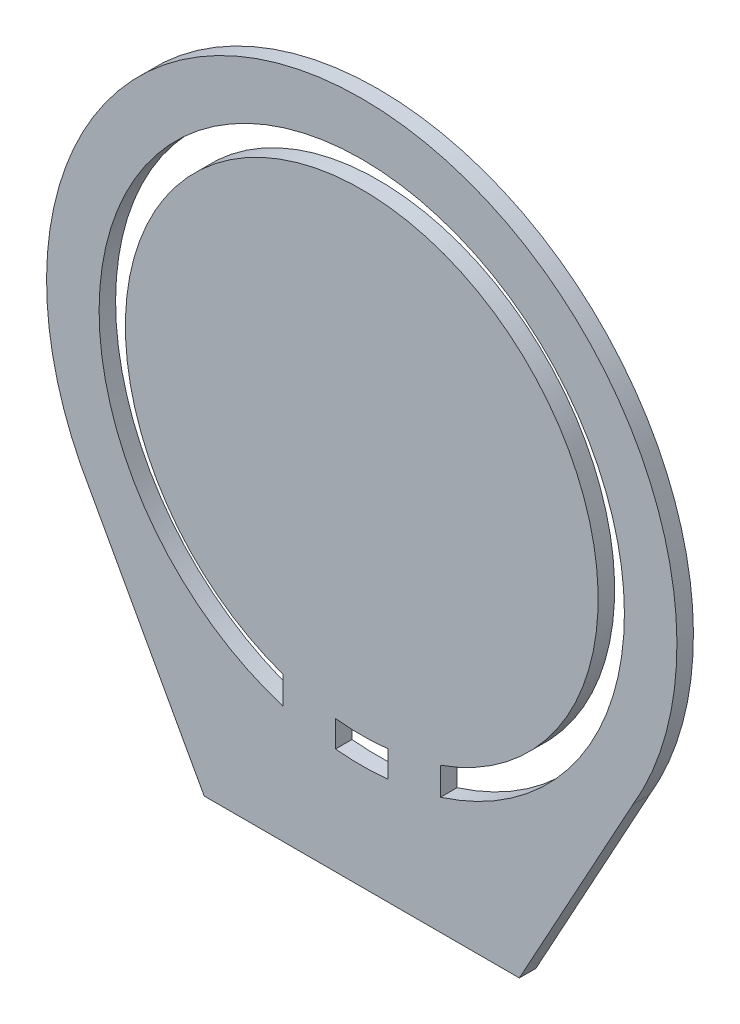
ISO-10303-21;
HEADER;
FILE_DESCRIPTION(('STEP AP214'),'2;1');
FILE_NAME('part.step','',(''),(''),'','','');
FILE_SCHEMA(('AUTOMOTIVE_DESIGN { 1 0 10303 214 1 1 1 1 }'));
ENDSEC;
DATA;
#1=APPLICATION_CONTEXT('core data for automotive mechanical design processes');
#2=APPLICATION_PROTOCOL_DEFINITION('international standard','automotive_design',2000,#1);
#3=PRODUCT_CONTEXT('',#1,'mechanical');
#4=PRODUCT('Part','Part','',(#3));
#5=PRODUCT_RELATED_PRODUCT_CATEGORY('part','',(#4));
#6=PRODUCT_DEFINITION_FORMATION('','',#4);
#7=PRODUCT_DEFINITION_CONTEXT('part definition',#1,'design');
#8=PRODUCT_DEFINITION('design','',#6,#7);
#9=PRODUCT_DEFINITION_SHAPE('','',#8);
#10=(LENGTH_UNIT() NAMED_UNIT(*) SI_UNIT(.MILLI.,.METRE.));
#11=(NAMED_UNIT(*) PLANE_ANGLE_UNIT() SI_UNIT($,.RADIAN.));
#12=(NAMED_UNIT(*) SI_UNIT($,.STERADIAN.) SOLID_ANGLE_UNIT());
#13=UNCERTAINTY_MEASURE_WITH_UNIT(LENGTH_MEASURE(1.E-05),#10,'distance_accuracy_value','');
#14=(GEOMETRIC_REPRESENTATION_CONTEXT(3) GLOBAL_UNCERTAINTY_ASSIGNED_CONTEXT((#13)) GLOBAL_UNIT_ASSIGNED_CONTEXT((#10,
#11,#12)) REPRESENTATION_CONTEXT('',''));
#15=CARTESIAN_POINT('',(0.,0.,0.));
#16=DIRECTION('',(0.,0.,1.));
#17=DIRECTION('',(1.,0.,0.));
#18=AXIS2_PLACEMENT_3D('',#15,#16,#17);
#19=CARTESIAN_POINT('',(0.,0.,1.57));
#20=DIRECTION('',(0.,0.,-1.));
#21=DIRECTION('',(-1.,0.,0.));
#22=AXIS2_PLACEMENT_3D('',#19,#20,#21);
#23=CYLINDRICAL_SURFACE('',#22,25.);
#24=CARTESIAN_POINT('',(0.,0.,0.));
#25=DIRECTION('',(0.,0.,1.));
#26=DIRECTION('',(1.,0.,0.));
#27=AXIS2_PLACEMENT_3D('',#24,#25,#26);
#28=CIRCLE('',#27,25.);
#29=CARTESIAN_POINT('',(7.5,-23.8484800354236,0.));
#30=VERTEX_POINT('',#29);
#31=CARTESIAN_POINT('',(-7.5,-23.8484800354236,0.));
#32=VERTEX_POINT('',#31);
#33=EDGE_CURVE('E191',#30,#32,#28,.T.);
#34=ORIENTED_EDGE('',*,*,#33,.F.);
#35=DIRECTION('',(0.,0.,-1.));
#36=VECTOR('',#35,1.);
#37=CARTESIAN_POINT('',(7.5,-23.8484800354236,1.57));
#38=LINE('',#37,#36);
#39=CARTESIAN_POINT('',(7.5,-23.8484800354236,1.57));
#40=VERTEX_POINT('',#39);
#41=EDGE_CURVE('E47',#30,#40,#38,.F.);
#42=ORIENTED_EDGE('',*,*,#41,.T.);
#43=CARTESIAN_POINT('',(0.,0.,1.57));
#44=DIRECTION('',(0.,0.,1.));
#45=DIRECTION('',(1.,0.,0.));
#46=AXIS2_PLACEMENT_3D('',#43,#44,#45);
#47=CIRCLE('',#46,25.);
#48=CARTESIAN_POINT('',(-7.5,-23.8484800354236,1.57));
#49=VERTEX_POINT('',#48);
#50=EDGE_CURVE('E202',#40,#49,#47,.T.);
#51=ORIENTED_EDGE('',*,*,#50,.T.);
#52=DIRECTION('',(0.,0.,-1.));
#53=VECTOR('',#52,1.);
#54=CARTESIAN_POINT('',(-7.5,-23.8484800354236,1.57));
#55=LINE('',#54,#53);
#56=EDGE_CURVE('E211',#32,#49,#55,.F.);
#57=ORIENTED_EDGE('',*,*,#56,.F.);
#58=EDGE_LOOP('',(#34,#42,#51,#57));
#59=FACE_BOUND('',#58,.T.);
#60=ADVANCED_FACE('F39',(#59),#23,.F.);
#61=CARTESIAN_POINT('',(0.,0.,1.57));
#62=DIRECTION('',(0.,0.,-1.));
#63=DIRECTION('',(-1.,0.,0.));
#64=AXIS2_PLACEMENT_3D('',#61,#62,#63);
#65=CYLINDRICAL_SURFACE('',#64,30.);
#66=DIRECTION('',(0.,0.,1.));
#67=VECTOR('',#66,1.);
#68=CARTESIAN_POINT('',(-25.8005366625302,-15.3079165115778,0.));
#69=LINE('',#68,#67);
#70=CARTESIAN_POINT('',(-25.8005366625302,-15.3079165115778,0.));
#71=VERTEX_POINT('',#70);
#72=CARTESIAN_POINT('',(-25.8005366625302,-15.3079165115778,1.57));
#73=VERTEX_POINT('',#72);
#74=EDGE_CURVE('E188',#71,#73,#69,.T.);
#75=ORIENTED_EDGE('',*,*,#74,.T.);
#76=CARTESIAN_POINT('',(0.,0.,1.57));
#77=DIRECTION('',(0.,0.,1.));
#78=DIRECTION('',(1.,0.,0.));
#79=AXIS2_PLACEMENT_3D('',#76,#77,#78);
#80=CIRCLE('',#79,30.);
#81=CARTESIAN_POINT('',(25.8005366625301,-15.3079165115779,1.57));
#82=VERTEX_POINT('',#81);
#83=EDGE_CURVE('E205',#82,#73,#80,.T.);
#84=ORIENTED_EDGE('',*,*,#83,.F.);
#85=DIRECTION('',(0.,0.,1.));
#86=VECTOR('',#85,1.);
#87=CARTESIAN_POINT('',(25.8005366625301,-15.3079165115779,0.));
#88=LINE('',#87,#86);
#89=CARTESIAN_POINT('',(25.8005366625301,-15.3079165115779,0.));
#90=VERTEX_POINT('',#89);
#91=EDGE_CURVE('E192',#90,#82,#88,.T.);
#92=ORIENTED_EDGE('',*,*,#91,.F.);
#93=CARTESIAN_POINT('',(0.,0.,0.));
#94=DIRECTION('',(0.,0.,1.));
#95=DIRECTION('',(1.,0.,0.));
#96=AXIS2_PLACEMENT_3D('',#93,#94,#95);
#97=CIRCLE('',#96,30.);
#98=EDGE_CURVE('E201',#90,#71,#97,.T.);
#99=ORIENTED_EDGE('',*,*,#98,.T.);
#100=EDGE_LOOP('',(#75,#84,#92,#99));
#101=FACE_BOUND('',#100,.T.);
#102=ADVANCED_FACE('F41',(#101),#65,.T.);
#103=CARTESIAN_POINT('',(0.,0.,1.57));
#104=DIRECTION('',(0.,0.,1.));
#105=DIRECTION('',(1.,0.,0.));
#106=AXIS2_PLACEMENT_3D('',#103,#104,#105);
#107=PLANE('',#106);
#108=DIRECTION('',(0.,1.,0.));
#109=VECTOR('',#108,1.);
#110=CARTESIAN_POINT('',(-2.5,0.,1.57));
#111=LINE('',#110,#109);
#112=CARTESIAN_POINT('',(-2.5,-24.8746859276655,1.57));
#113=VERTEX_POINT('',#112);
#114=CARTESIAN_POINT('',(-2.5,-22.3606797749979,1.57));
#115=VERTEX_POINT('',#114);
#116=EDGE_CURVE('E145',#113,#115,#111,.T.);
#117=ORIENTED_EDGE('',*,*,#116,.T.);
#118=CARTESIAN_POINT('',(0.,0.,1.57));
#119=DIRECTION('',(0.,0.,1.));
#120=DIRECTION('',(1.,0.,0.));
#121=AXIS2_PLACEMENT_3D('',#118,#119,#120);
#122=CIRCLE('',#121,22.5);
#123=CARTESIAN_POINT('',(2.5,-22.3606797749979,1.57));
#124=VERTEX_POINT('',#123);
#125=EDGE_CURVE('E143',#115,#124,#122,.T.);
#126=ORIENTED_EDGE('',*,*,#125,.T.);
#127=DIRECTION('',(0.,1.,0.));
#128=VECTOR('',#127,1.);
#129=CARTESIAN_POINT('',(2.5,0.,1.57));
#130=LINE('',#129,#128);
#131=CARTESIAN_POINT('',(2.5,-24.8746859276655,1.57));
#132=VERTEX_POINT('',#131);
#133=EDGE_CURVE('E158',#132,#124,#130,.T.);
#134=ORIENTED_EDGE('',*,*,#133,.F.);
#135=EDGE_CURVE('E198',#113,#132,#47,.T.);
#136=ORIENTED_EDGE('',*,*,#135,.F.);
#137=EDGE_LOOP('',(#117,#126,#134,#136));
#138=FACE_BOUND('',#137,.T.);
#139=CARTESIAN_POINT('',(7.5,-21.2132034355964,1.57));
#140=VERTEX_POINT('',#139);
#141=CARTESIAN_POINT('',(-7.5,-21.2132034355964,1.57));
#142=VERTEX_POINT('',#141);
#143=EDGE_CURVE('E155',#140,#142,#122,.T.);
#144=ORIENTED_EDGE('',*,*,#143,.T.);
#145=DIRECTION('',(0.,1.,0.));
#146=VECTOR('',#145,1.);
#147=CARTESIAN_POINT('',(-7.5,0.,1.57));
#148=LINE('',#147,#146);
#149=EDGE_CURVE('E134',#49,#142,#148,.T.);
#150=ORIENTED_EDGE('',*,*,#149,.F.);
#151=ORIENTED_EDGE('',*,*,#50,.F.);
#152=DIRECTION('',(0.,1.,0.));
#153=VECTOR('',#152,1.);
#154=CARTESIAN_POINT('',(7.5,0.,1.57));
#155=LINE('',#154,#153);
#156=EDGE_CURVE('E160',#40,#140,#155,.T.);
#157=ORIENTED_EDGE('',*,*,#156,.T.);
#158=EDGE_LOOP('',(#144,#150,#151,#157));
#159=FACE_BOUND('',#158,.T.);
#160=ORIENTED_EDGE('',*,*,#83,.T.);
#161=DIRECTION('',(-0.480889164745887,0.876781393067852,0.));
#162=VECTOR('',#161,1.);
#163=CARTESIAN_POINT('',(-26.2883976806498,-14.4184236836069,1.57));
#164=LINE('',#163,#162);
#165=CARTESIAN_POINT('',(-15.,-35.,1.57));
#166=VERTEX_POINT('',#165);
#167=EDGE_CURVE('E173',#166,#73,#164,.T.);
#168=ORIENTED_EDGE('',*,*,#167,.F.);
#169=DIRECTION('',(1.,0.,0.));
#170=VECTOR('',#169,1.);
#171=CARTESIAN_POINT('',(0.,-35.,1.57));
#172=LINE('',#171,#170);
#173=CARTESIAN_POINT('',(15.,-35.,1.57));
#174=VERTEX_POINT('',#173);
#175=EDGE_CURVE('E184',#166,#174,#172,.T.);
#176=ORIENTED_EDGE('',*,*,#175,.T.);
#177=DIRECTION('',(0.480889164745886,0.876781393067852,0.));
#178=VECTOR('',#177,1.);
#179=CARTESIAN_POINT('',(26.2883976806498,-14.4184236836069,1.57));
#180=LINE('',#179,#178);
#181=EDGE_CURVE('E177',#174,#82,#180,.T.);
#182=ORIENTED_EDGE('',*,*,#181,.T.);
#183=EDGE_LOOP('',(#160,#168,#176,#182));
#184=FACE_BOUND('',#183,.T.);
#185=ADVANCED_FACE('F221',(#138,#159,#184),#107,.T.);
#186=CARTESIAN_POINT('',(0.,0.,0.));
#187=DIRECTION('',(0.,0.,1.));
#188=DIRECTION('',(1.,0.,0.));
#189=AXIS2_PLACEMENT_3D('',#186,#187,#188);
#190=PLANE('',#189);
#191=CARTESIAN_POINT('',(0.,0.,0.));
#192=DIRECTION('',(0.,0.,1.));
#193=DIRECTION('',(1.,0.,0.));
#194=AXIS2_PLACEMENT_3D('',#191,#192,#193);
#195=CIRCLE('',#194,22.5);
#196=CARTESIAN_POINT('',(-2.5,-22.3606797749979,0.));
#197=VERTEX_POINT('',#196);
#198=CARTESIAN_POINT('',(2.5,-22.3606797749979,0.));
#199=VERTEX_POINT('',#198);
#200=EDGE_CURVE('E141',#197,#199,#195,.T.);
#201=ORIENTED_EDGE('',*,*,#200,.F.);
#202=DIRECTION('',(0.,1.,0.));
#203=VECTOR('',#202,1.);
#204=CARTESIAN_POINT('',(-2.5,0.,0.));
#205=LINE('',#204,#203);
#206=CARTESIAN_POINT('',(-2.5,-24.8746859276655,0.));
#207=VERTEX_POINT('',#206);
#208=EDGE_CURVE('E62',#207,#197,#205,.T.);
#209=ORIENTED_EDGE('',*,*,#208,.F.);
#210=CARTESIAN_POINT('',(2.5,-24.8746859276655,0.));
#211=VERTEX_POINT('',#210);
#212=EDGE_CURVE('E203',#207,#211,#28,.T.);
#213=ORIENTED_EDGE('',*,*,#212,.T.);
#214=DIRECTION('',(0.,1.,0.));
#215=VECTOR('',#214,1.);
#216=CARTESIAN_POINT('',(2.5,0.,0.));
#217=LINE('',#216,#215);
#218=EDGE_CURVE('E148',#211,#199,#217,.T.);
#219=ORIENTED_EDGE('',*,*,#218,.T.);
#220=EDGE_LOOP('',(#201,#209,#213,#219));
#221=FACE_BOUND('',#220,.T.);
#222=DIRECTION('',(0.,1.,0.));
#223=VECTOR('',#222,1.);
#224=CARTESIAN_POINT('',(-7.5,0.,0.));
#225=LINE('',#224,#223);
#226=CARTESIAN_POINT('',(-7.5,-21.2132034355964,0.));
#227=VERTEX_POINT('',#226);
#228=EDGE_CURVE('E135',#32,#227,#225,.T.);
#229=ORIENTED_EDGE('',*,*,#228,.T.);
#230=CARTESIAN_POINT('',(7.5,-21.2132034355964,0.));
#231=VERTEX_POINT('',#230);
#232=EDGE_CURVE('E150',#231,#227,#195,.T.);
#233=ORIENTED_EDGE('',*,*,#232,.F.);
#234=DIRECTION('',(0.,1.,0.));
#235=VECTOR('',#234,1.);
#236=CARTESIAN_POINT('',(7.5,0.,0.));
#237=LINE('',#236,#235);
#238=EDGE_CURVE('E54',#30,#231,#237,.T.);
#239=ORIENTED_EDGE('',*,*,#238,.F.);
#240=ORIENTED_EDGE('',*,*,#33,.T.);
#241=EDGE_LOOP('',(#229,#233,#239,#240));
#242=FACE_BOUND('',#241,.T.);
#243=ORIENTED_EDGE('',*,*,#98,.F.);
#244=DIRECTION('',(0.480889164745886,0.876781393067852,0.));
#245=VECTOR('',#244,1.);
#246=CARTESIAN_POINT('',(26.2883976806498,-14.4184236836069,0.));
#247=LINE('',#246,#245);
#248=CARTESIAN_POINT('',(15.,-35.,0.));
#249=VERTEX_POINT('',#248);
#250=EDGE_CURVE('E180',#249,#90,#247,.T.);
#251=ORIENTED_EDGE('',*,*,#250,.F.);
#252=DIRECTION('',(1.,0.,0.));
#253=VECTOR('',#252,1.);
#254=CARTESIAN_POINT('',(0.,-35.,0.));
#255=LINE('',#254,#253);
#256=CARTESIAN_POINT('',(-15.,-35.,0.));
#257=VERTEX_POINT('',#256);
#258=EDGE_CURVE('E176',#257,#249,#255,.T.);
#259=ORIENTED_EDGE('',*,*,#258,.F.);
#260=DIRECTION('',(-0.480889164745887,0.876781393067852,0.));
#261=VECTOR('',#260,1.);
#262=CARTESIAN_POINT('',(-26.2883976806498,-14.4184236836069,0.));
#263=LINE('',#262,#261);
#264=EDGE_CURVE('E174',#257,#71,#263,.T.);
#265=ORIENTED_EDGE('',*,*,#264,.T.);
#266=EDGE_LOOP('',(#243,#251,#259,#265));
#267=FACE_BOUND('',#266,.T.);
#268=ADVANCED_FACE('F147',(#221,#242,#267),#190,.F.);
#269=DIRECTION('',(0.,0.,-1.));
#270=VECTOR('',#269,1.);
#271=CARTESIAN_POINT('',(2.5,-24.8746859276655,1.57));
#272=LINE('',#271,#270);
#273=EDGE_CURVE('E11',#211,#132,#272,.F.);
#274=ORIENTED_EDGE('',*,*,#273,.F.);
#275=ORIENTED_EDGE('',*,*,#212,.F.);
#276=DIRECTION('',(0.,0.,-1.));
#277=VECTOR('',#276,1.);
#278=CARTESIAN_POINT('',(-2.5,-24.8746859276655,1.57));
#279=LINE('',#278,#277);
#280=EDGE_CURVE('E132',#207,#113,#279,.F.);
#281=ORIENTED_EDGE('',*,*,#280,.T.);
#282=ORIENTED_EDGE('',*,*,#135,.T.);
#283=EDGE_LOOP('',(#274,#275,#281,#282));
#284=FACE_BOUND('',#283,.T.);
#285=ADVANCED_FACE('F233',(#284),#23,.F.);
#286=CARTESIAN_POINT('',(-26.2883976806498,-14.4184236836069,0.));
#287=DIRECTION('',(0.876781393067852,0.480889164745887,0.));
#288=DIRECTION('',(-0.480889164745887,0.876781393067852,0.));
#289=AXIS2_PLACEMENT_3D('',#286,#287,#288);
#290=PLANE('',#289);
#291=ORIENTED_EDGE('',*,*,#167,.T.);
#292=ORIENTED_EDGE('',*,*,#74,.F.);
#293=ORIENTED_EDGE('',*,*,#264,.F.);
#294=DIRECTION('',(0.,0.,1.));
#295=VECTOR('',#294,1.);
#296=CARTESIAN_POINT('',(-15.,-35.,0.));
#297=LINE('',#296,#295);
#298=EDGE_CURVE('E182',#257,#166,#297,.T.);
#299=ORIENTED_EDGE('',*,*,#298,.T.);
#300=EDGE_LOOP('',(#291,#292,#293,#299));
#301=FACE_BOUND('',#300,.T.);
#302=ADVANCED_FACE('F250',(#301),#290,.F.);
#303=CARTESIAN_POINT('',(26.2883976806498,-14.4184236836069,0.));
#304=DIRECTION('',(0.876781393067852,-0.480889164745886,0.));
#305=DIRECTION('',(0.480889164745886,0.876781393067852,0.));
#306=AXIS2_PLACEMENT_3D('',#303,#304,#305);
#307=PLANE('',#306);
#308=ORIENTED_EDGE('',*,*,#181,.F.);
#309=DIRECTION('',(0.,0.,1.));
#310=VECTOR('',#309,1.);
#311=CARTESIAN_POINT('',(15.,-35.,0.));
#312=LINE('',#311,#310);
#313=EDGE_CURVE('E195',#249,#174,#312,.T.);
#314=ORIENTED_EDGE('',*,*,#313,.F.);
#315=ORIENTED_EDGE('',*,*,#250,.T.);
#316=ORIENTED_EDGE('',*,*,#91,.T.);
#317=EDGE_LOOP('',(#308,#314,#315,#316));
#318=FACE_BOUND('',#317,.T.);
#319=ADVANCED_FACE('F244',(#318),#307,.T.);
#320=CARTESIAN_POINT('',(0.,-35.,0.));
#321=DIRECTION('',(0.,-1.,0.));
#322=DIRECTION('',(0.,0.,-1.));
#323=AXIS2_PLACEMENT_3D('',#320,#321,#322);
#324=PLANE('',#323);
#325=ORIENTED_EDGE('',*,*,#175,.F.);
#326=ORIENTED_EDGE('',*,*,#298,.F.);
#327=ORIENTED_EDGE('',*,*,#258,.T.);
#328=ORIENTED_EDGE('',*,*,#313,.T.);
#329=EDGE_LOOP('',(#325,#326,#327,#328));
#330=FACE_BOUND('',#329,.T.);
#331=ADVANCED_FACE('F247',(#330),#324,.T.);
#332=CARTESIAN_POINT('',(-7.5,0.,1.57));
#333=DIRECTION('',(-1.,0.,0.));
#334=DIRECTION('',(0.,0.,1.));
#335=AXIS2_PLACEMENT_3D('',#332,#333,#334);
#336=PLANE('',#335);
#337=ORIENTED_EDGE('',*,*,#228,.F.);
#338=ORIENTED_EDGE('',*,*,#56,.T.);
#339=ORIENTED_EDGE('',*,*,#149,.T.);
#340=DIRECTION('',(0.,0.,-1.));
#341=VECTOR('',#340,1.);
#342=CARTESIAN_POINT('',(-7.5,-21.2132034355964,1.57));
#343=LINE('',#342,#341);
#344=EDGE_CURVE('E144',#142,#227,#343,.T.);
#345=ORIENTED_EDGE('',*,*,#344,.T.);
#346=EDGE_LOOP('',(#337,#338,#339,#345));
#347=FACE_BOUND('',#346,.T.);
#348=ADVANCED_FACE('F228',(#347),#336,.T.);
#349=CARTESIAN_POINT('',(-2.5,0.,1.57));
#350=DIRECTION('',(-1.,0.,0.));
#351=DIRECTION('',(0.,0.,1.));
#352=AXIS2_PLACEMENT_3D('',#349,#350,#351);
#353=PLANE('',#352);
#354=ORIENTED_EDGE('',*,*,#280,.F.);
#355=ORIENTED_EDGE('',*,*,#208,.T.);
#356=DIRECTION('',(0.,0.,-1.));
#357=VECTOR('',#356,1.);
#358=CARTESIAN_POINT('',(-2.5,-22.3606797749979,1.57));
#359=LINE('',#358,#357);
#360=EDGE_CURVE('E129',#115,#197,#359,.T.);
#361=ORIENTED_EDGE('',*,*,#360,.F.);
#362=ORIENTED_EDGE('',*,*,#116,.F.);
#363=EDGE_LOOP('',(#354,#355,#361,#362));
#364=FACE_BOUND('',#363,.T.);
#365=ADVANCED_FACE('F128',(#364),#353,.F.);
#366=CARTESIAN_POINT('',(2.5,0.,1.57));
#367=DIRECTION('',(-1.,0.,0.));
#368=DIRECTION('',(0.,0.,1.));
#369=AXIS2_PLACEMENT_3D('',#366,#367,#368);
#370=PLANE('',#369);
#371=ORIENTED_EDGE('',*,*,#218,.F.);
#372=ORIENTED_EDGE('',*,*,#273,.T.);
#373=ORIENTED_EDGE('',*,*,#133,.T.);
#374=DIRECTION('',(0.,0.,-1.));
#375=VECTOR('',#374,1.);
#376=CARTESIAN_POINT('',(2.5,-22.3606797749979,1.57));
#377=LINE('',#376,#375);
#378=EDGE_CURVE('E166',#124,#199,#377,.T.);
#379=ORIENTED_EDGE('',*,*,#378,.T.);
#380=EDGE_LOOP('',(#371,#372,#373,#379));
#381=FACE_BOUND('',#380,.T.);
#382=ADVANCED_FACE('F271',(#381),#370,.T.);
#383=CARTESIAN_POINT('',(7.5,0.,1.57));
#384=DIRECTION('',(-1.,0.,0.));
#385=DIRECTION('',(0.,0.,1.));
#386=AXIS2_PLACEMENT_3D('',#383,#384,#385);
#387=PLANE('',#386);
#388=ORIENTED_EDGE('',*,*,#41,.F.);
#389=ORIENTED_EDGE('',*,*,#238,.T.);
#390=DIRECTION('',(0.,0.,-1.));
#391=VECTOR('',#390,1.);
#392=CARTESIAN_POINT('',(7.5,-21.2132034355964,1.57));
#393=LINE('',#392,#391);
#394=EDGE_CURVE('E161',#140,#231,#393,.T.);
#395=ORIENTED_EDGE('',*,*,#394,.F.);
#396=ORIENTED_EDGE('',*,*,#156,.F.);
#397=EDGE_LOOP('',(#388,#389,#395,#396));
#398=FACE_BOUND('',#397,.T.);
#399=ADVANCED_FACE('F273',(#398),#387,.F.);
#400=CARTESIAN_POINT('',(0.,0.,0.));
#401=DIRECTION('',(0.,0.,1.));
#402=DIRECTION('',(1.,0.,0.));
#403=AXIS2_PLACEMENT_3D('',#400,#401,#402);
#404=CYLINDRICAL_SURFACE('',#403,22.5);
#405=ORIENTED_EDGE('',*,*,#360,.T.);
#406=ORIENTED_EDGE('',*,*,#200,.T.);
#407=ORIENTED_EDGE('',*,*,#378,.F.);
#408=ORIENTED_EDGE('',*,*,#125,.F.);
#409=EDGE_LOOP('',(#405,#406,#407,#408));
#410=FACE_BOUND('',#409,.T.);
#411=ADVANCED_FACE('F139',(#410),#404,.T.);
#412=ORIENTED_EDGE('',*,*,#232,.T.);
#413=ORIENTED_EDGE('',*,*,#344,.F.);
#414=ORIENTED_EDGE('',*,*,#143,.F.);
#415=ORIENTED_EDGE('',*,*,#394,.T.);
#416=EDGE_LOOP('',(#412,#413,#414,#415));
#417=FACE_BOUND('',#416,.T.);
#418=ADVANCED_FACE('F230',(#417),#404,.T.);
#419=CLOSED_SHELL('',(#60,#102,#185,#268,#285,#302,#319,#331,#348,#365,#382,#399,#411,#418));
#420=MANIFOLD_SOLID_BREP('B2',#419);
#421=ADVANCED_BREP_SHAPE_REPRESENTATION('',(#18,#420),#14);
#422=SHAPE_DEFINITION_REPRESENTATION(#9,#421);
ENDSEC;
END-ISO-10303-21;
